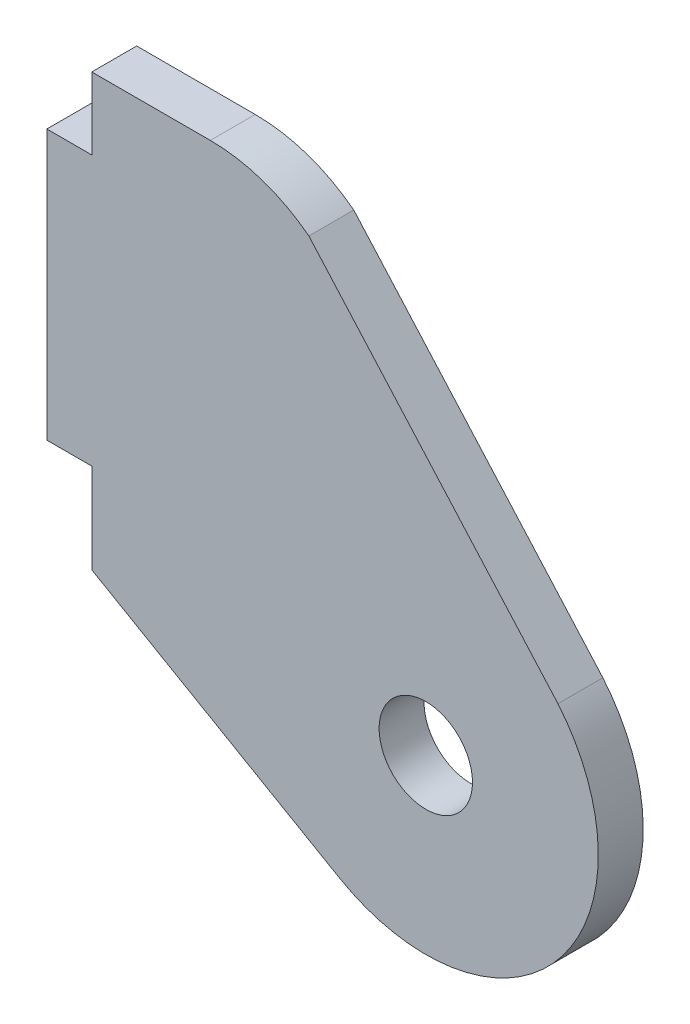
ISO-10303-21;
HEADER;
FILE_DESCRIPTION(('STEP AP214'),'2;1');
FILE_NAME('part.step','',(''),(''),'','','');
FILE_SCHEMA(('AUTOMOTIVE_DESIGN { 1 0 10303 214 1 1 1 1 }'));
ENDSEC;
DATA;
#1=APPLICATION_CONTEXT('core data for automotive mechanical design processes');
#2=APPLICATION_PROTOCOL_DEFINITION('international standard','automotive_design',2000,#1);
#3=PRODUCT_CONTEXT('',#1,'mechanical');
#4=PRODUCT('Part','Part','',(#3));
#5=PRODUCT_RELATED_PRODUCT_CATEGORY('part','',(#4));
#6=PRODUCT_DEFINITION_FORMATION('','',#4);
#7=PRODUCT_DEFINITION_CONTEXT('part definition',#1,'design');
#8=PRODUCT_DEFINITION('design','',#6,#7);
#9=PRODUCT_DEFINITION_SHAPE('','',#8);
#10=(LENGTH_UNIT() NAMED_UNIT(*) SI_UNIT(.MILLI.,.METRE.));
#11=(NAMED_UNIT(*) PLANE_ANGLE_UNIT() SI_UNIT($,.RADIAN.));
#12=(NAMED_UNIT(*) SI_UNIT($,.STERADIAN.) SOLID_ANGLE_UNIT());
#13=UNCERTAINTY_MEASURE_WITH_UNIT(LENGTH_MEASURE(1.E-05),#10,'distance_accuracy_value','');
#14=(GEOMETRIC_REPRESENTATION_CONTEXT(3) GLOBAL_UNCERTAINTY_ASSIGNED_CONTEXT((#13)) GLOBAL_UNIT_ASSIGNED_CONTEXT((#10,
#11,#12)) REPRESENTATION_CONTEXT('',''));
#15=CARTESIAN_POINT('',(0.,0.,0.));
#16=DIRECTION('',(0.,0.,1.));
#17=DIRECTION('',(1.,0.,0.));
#18=AXIS2_PLACEMENT_3D('',#15,#16,#17);
#19=CARTESIAN_POINT('',(-52.6209060337579,-54.7758049115137,3.175));
#20=DIRECTION('',(0.,0.,1.));
#21=DIRECTION('',(1.,0.,0.));
#22=AXIS2_PLACEMENT_3D('',#19,#20,#21);
#23=PLANE('',#22);
#24=DIRECTION('',(1.,0.,0.));
#25=VECTOR('',#24,1.);
#26=CARTESIAN_POINT('',(-79.4095433377579,-48.870574021423,3.175));
#27=LINE('',#26,#25);
#28=CARTESIAN_POINT('',(-79.4095433377579,-48.870574021423,3.175));
#29=VERTEX_POINT('',#28);
#30=CARTESIAN_POINT('',(-76.2345433377579,-48.870574021423,3.175));
#31=VERTEX_POINT('',#30);
#32=EDGE_CURVE('E190',#29,#31,#27,.T.);
#33=ORIENTED_EDGE('',*,*,#32,.T.);
#34=DIRECTION('',(0.,-1.,0.));
#35=VECTOR('',#34,1.);
#36=CARTESIAN_POINT('',(-76.2345433377579,-48.870574021423,3.175));
#37=LINE('',#36,#35);
#38=CARTESIAN_POINT('',(-76.2345433377579,-55.220574021423,3.175));
#39=VERTEX_POINT('',#38);
#40=EDGE_CURVE('E114',#31,#39,#37,.T.);
#41=ORIENTED_EDGE('',*,*,#40,.T.);
#42=DIRECTION('',(0.86602540378444,-0.499999999999998,0.));
#43=VECTOR('',#42,1.);
#44=CARTESIAN_POINT('',(-76.2345433377579,-55.220574021423,3.175));
#45=LINE('',#44,#43);
#46=CARTESIAN_POINT('',(-58.7169060337579,-65.3343866344536,3.175));
#47=VERTEX_POINT('',#46);
#48=EDGE_CURVE('E219',#39,#47,#45,.T.);
#49=ORIENTED_EDGE('',*,*,#48,.T.);
#50=CARTESIAN_POINT('',(-52.6209060337579,-54.7758049115137,3.175));
#51=DIRECTION('',(0.,0.,1.));
#52=DIRECTION('',(1.,0.,0.));
#53=AXIS2_PLACEMENT_3D('',#50,#51,#52);
#54=CIRCLE('',#53,12.192);
#55=CARTESIAN_POINT('',(-43.2812921832516,-46.9389383742151,3.175));
#56=VERTEX_POINT('',#55);
#57=EDGE_CURVE('E239',#47,#56,#54,.T.);
#58=ORIENTED_EDGE('',*,*,#57,.T.);
#59=DIRECTION('',(-0.663926694796662,0.747797662430407,0.));
#60=VECTOR('',#59,1.);
#61=CARTESIAN_POINT('',(-60.8896531494987,-27.1061898599786,3.175));
#62=LINE('',#61,#60);
#63=CARTESIAN_POINT('',(-60.8896531494987,-27.1061898599786,3.175));
#64=VERTEX_POINT('',#63);
#65=EDGE_CURVE('E235',#56,#64,#62,.T.);
#66=ORIENTED_EDGE('',*,*,#65,.T.);
#67=CARTESIAN_POINT('',(-67.8525433377579,-36.170574021423,3.175));
#68=DIRECTION('',(0.,0.,1.));
#69=DIRECTION('',(-1.,0.,0.));
#70=AXIS2_PLACEMENT_3D('',#67,#68,#69);
#71=CIRCLE('',#70,11.43);
#72=CARTESIAN_POINT('',(-67.8525433377579,-24.740574021423,3.175));
#73=VERTEX_POINT('',#72);
#74=EDGE_CURVE('E238',#64,#73,#71,.T.);
#75=ORIENTED_EDGE('',*,*,#74,.T.);
#76=DIRECTION('',(-1.,0.,0.));
#77=VECTOR('',#76,1.);
#78=CARTESIAN_POINT('',(-76.2345433377579,-24.740574021423,3.175));
#79=LINE('',#78,#77);
#80=CARTESIAN_POINT('',(-76.2345433377579,-24.740574021423,3.175));
#81=VERTEX_POINT('',#80);
#82=EDGE_CURVE('E139',#73,#81,#79,.T.);
#83=ORIENTED_EDGE('',*,*,#82,.T.);
#84=DIRECTION('',(0.,-1.,0.));
#85=VECTOR('',#84,1.);
#86=CARTESIAN_POINT('',(-76.2345433377579,-29.820574021423,3.175));
#87=LINE('',#86,#85);
#88=CARTESIAN_POINT('',(-76.2345433377579,-29.820574021423,3.175));
#89=VERTEX_POINT('',#88);
#90=EDGE_CURVE('E133',#81,#89,#87,.T.);
#91=ORIENTED_EDGE('',*,*,#90,.T.);
#92=DIRECTION('',(-1.,0.,0.));
#93=VECTOR('',#92,1.);
#94=CARTESIAN_POINT('',(-79.4095433377579,-29.820574021423,3.175));
#95=LINE('',#94,#93);
#96=CARTESIAN_POINT('',(-79.4095433377579,-29.820574021423,3.175));
#97=VERTEX_POINT('',#96);
#98=EDGE_CURVE('E137',#89,#97,#95,.T.);
#99=ORIENTED_EDGE('',*,*,#98,.T.);
#100=DIRECTION('',(0.,-1.,0.));
#101=VECTOR('',#100,1.);
#102=CARTESIAN_POINT('',(-79.4095433377579,-48.870574021423,3.175));
#103=LINE('',#102,#101);
#104=EDGE_CURVE('E65',#97,#29,#103,.T.);
#105=ORIENTED_EDGE('',*,*,#104,.T.);
#106=EDGE_LOOP('',(#33,#41,#49,#58,#66,#75,#83,#91,#99,#105));
#107=FACE_BOUND('',#106,.T.);
#108=CARTESIAN_POINT('',(-52.6209060337579,-54.7758049115137,3.175));
#109=DIRECTION('',(0.,0.,1.));
#110=DIRECTION('',(1.,0.,0.));
#111=AXIS2_PLACEMENT_3D('',#108,#109,#110);
#112=CIRCLE('',#111,3.3);
#113=CARTESIAN_POINT('',(-49.3209060337579,-54.7758049115137,3.175));
#114=VERTEX_POINT('',#113);
#115=EDGE_CURVE('E166',#114,#114,#112,.T.);
#116=ORIENTED_EDGE('',*,*,#115,.F.);
#117=EDGE_LOOP('',(#116));
#118=FACE_BOUND('',#117,.T.);
#119=ADVANCED_FACE('F47',(#107,#118),#23,.T.);
#120=CARTESIAN_POINT('',(-52.6209060337579,-54.7758049115137,0.));
#121=DIRECTION('',(0.,0.,1.));
#122=DIRECTION('',(1.,0.,0.));
#123=AXIS2_PLACEMENT_3D('',#120,#121,#122);
#124=PLANE('',#123);
#125=DIRECTION('',(1.,0.,0.));
#126=VECTOR('',#125,1.);
#127=CARTESIAN_POINT('',(-79.4095433377579,-48.870574021423,0.));
#128=LINE('',#127,#126);
#129=CARTESIAN_POINT('',(-79.4095433377579,-48.870574021423,0.));
#130=VERTEX_POINT('',#129);
#131=CARTESIAN_POINT('',(-76.2345433377579,-48.870574021423,0.));
#132=VERTEX_POINT('',#131);
#133=EDGE_CURVE('E161',#130,#132,#128,.T.);
#134=ORIENTED_EDGE('',*,*,#133,.F.);
#135=DIRECTION('',(0.,-1.,0.));
#136=VECTOR('',#135,1.);
#137=CARTESIAN_POINT('',(-79.4095433377579,-48.870574021423,0.));
#138=LINE('',#137,#136);
#139=CARTESIAN_POINT('',(-79.4095433377579,-29.820574021423,0.));
#140=VERTEX_POINT('',#139);
#141=EDGE_CURVE('E106',#140,#130,#138,.T.);
#142=ORIENTED_EDGE('',*,*,#141,.F.);
#143=DIRECTION('',(-1.,0.,0.));
#144=VECTOR('',#143,1.);
#145=CARTESIAN_POINT('',(-79.4095433377579,-29.820574021423,0.));
#146=LINE('',#145,#144);
#147=CARTESIAN_POINT('',(-76.2345433377579,-29.820574021423,0.));
#148=VERTEX_POINT('',#147);
#149=EDGE_CURVE('E100',#148,#140,#146,.T.);
#150=ORIENTED_EDGE('',*,*,#149,.F.);
#151=DIRECTION('',(0.,-1.,0.));
#152=VECTOR('',#151,1.);
#153=CARTESIAN_POINT('',(-76.2345433377579,-29.820574021423,0.));
#154=LINE('',#153,#152);
#155=CARTESIAN_POINT('',(-76.2345433377579,-24.740574021423,0.));
#156=VERTEX_POINT('',#155);
#157=EDGE_CURVE('E148',#156,#148,#154,.T.);
#158=ORIENTED_EDGE('',*,*,#157,.F.);
#159=DIRECTION('',(-1.,0.,0.));
#160=VECTOR('',#159,1.);
#161=CARTESIAN_POINT('',(-76.2345433377579,-24.740574021423,0.));
#162=LINE('',#161,#160);
#163=CARTESIAN_POINT('',(-67.8525433377579,-24.740574021423,0.));
#164=VERTEX_POINT('',#163);
#165=EDGE_CURVE('E181',#164,#156,#162,.T.);
#166=ORIENTED_EDGE('',*,*,#165,.F.);
#167=CARTESIAN_POINT('',(-67.8525433377579,-36.170574021423,0.));
#168=DIRECTION('',(0.,0.,1.));
#169=DIRECTION('',(-1.,0.,0.));
#170=AXIS2_PLACEMENT_3D('',#167,#168,#169);
#171=CIRCLE('',#170,11.43);
#172=CARTESIAN_POINT('',(-60.8896531494987,-27.1061898599786,0.));
#173=VERTEX_POINT('',#172);
#174=EDGE_CURVE('E178',#173,#164,#171,.T.);
#175=ORIENTED_EDGE('',*,*,#174,.F.);
#176=DIRECTION('',(-0.663926694796662,0.747797662430407,0.));
#177=VECTOR('',#176,1.);
#178=CARTESIAN_POINT('',(-60.8896531494987,-27.1061898599786,0.));
#179=LINE('',#178,#177);
#180=CARTESIAN_POINT('',(-43.2812921832516,-46.9389383742151,0.));
#181=VERTEX_POINT('',#180);
#182=EDGE_CURVE('E175',#181,#173,#179,.T.);
#183=ORIENTED_EDGE('',*,*,#182,.F.);
#184=CARTESIAN_POINT('',(-52.6209060337579,-54.7758049115137,0.));
#185=DIRECTION('',(0.,0.,1.));
#186=DIRECTION('',(1.,0.,0.));
#187=AXIS2_PLACEMENT_3D('',#184,#185,#186);
#188=CIRCLE('',#187,12.192);
#189=CARTESIAN_POINT('',(-58.7169060337579,-65.3343866344536,0.));
#190=VERTEX_POINT('',#189);
#191=EDGE_CURVE('E172',#190,#181,#188,.T.);
#192=ORIENTED_EDGE('',*,*,#191,.F.);
#193=DIRECTION('',(0.86602540378444,-0.499999999999998,0.));
#194=VECTOR('',#193,1.);
#195=CARTESIAN_POINT('',(-76.2345433377579,-55.220574021423,0.));
#196=LINE('',#195,#194);
#197=CARTESIAN_POINT('',(-76.2345433377579,-55.220574021423,0.));
#198=VERTEX_POINT('',#197);
#199=EDGE_CURVE('E169',#198,#190,#196,.T.);
#200=ORIENTED_EDGE('',*,*,#199,.F.);
#201=DIRECTION('',(0.,-1.,0.));
#202=VECTOR('',#201,1.);
#203=CARTESIAN_POINT('',(-76.2345433377579,-48.870574021423,0.));
#204=LINE('',#203,#202);
#205=EDGE_CURVE('E165',#132,#198,#204,.T.);
#206=ORIENTED_EDGE('',*,*,#205,.F.);
#207=EDGE_LOOP('',(#134,#142,#150,#158,#166,#175,#183,#192,#200,#206));
#208=FACE_BOUND('',#207,.T.);
#209=CARTESIAN_POINT('',(-52.6209060337579,-54.7758049115137,0.));
#210=DIRECTION('',(0.,0.,1.));
#211=DIRECTION('',(1.,0.,0.));
#212=AXIS2_PLACEMENT_3D('',#209,#210,#211);
#213=CIRCLE('',#212,3.3);
#214=CARTESIAN_POINT('',(-49.3209060337579,-54.7758049115137,0.));
#215=VERTEX_POINT('',#214);
#216=EDGE_CURVE('E253',#215,#215,#213,.T.);
#217=ORIENTED_EDGE('',*,*,#216,.T.);
#218=EDGE_LOOP('',(#217));
#219=FACE_BOUND('',#218,.T.);
#220=ADVANCED_FACE('F223',(#208,#219),#124,.F.);
#221=CARTESIAN_POINT('',(-79.4095433377579,-48.870574021423,3.175));
#222=DIRECTION('',(0.,1.,0.));
#223=DIRECTION('',(0.,0.,1.));
#224=AXIS2_PLACEMENT_3D('',#221,#222,#223);
#225=PLANE('',#224);
#226=ORIENTED_EDGE('',*,*,#133,.T.);
#227=DIRECTION('',(0.,0.,-1.));
#228=VECTOR('',#227,1.);
#229=CARTESIAN_POINT('',(-76.2345433377579,-48.870574021423,3.175));
#230=LINE('',#229,#228);
#231=EDGE_CURVE('E11',#31,#132,#230,.T.);
#232=ORIENTED_EDGE('',*,*,#231,.F.);
#233=ORIENTED_EDGE('',*,*,#32,.F.);
#234=DIRECTION('',(0.,0.,-1.));
#235=VECTOR('',#234,1.);
#236=CARTESIAN_POINT('',(-79.4095433377579,-48.870574021423,3.175));
#237=LINE('',#236,#235);
#238=EDGE_CURVE('E157',#29,#130,#237,.T.);
#239=ORIENTED_EDGE('',*,*,#238,.T.);
#240=EDGE_LOOP('',(#226,#232,#233,#239));
#241=FACE_BOUND('',#240,.T.);
#242=ADVANCED_FACE('F49',(#241),#225,.F.);
#243=CARTESIAN_POINT('',(-76.2345433377579,-48.870574021423,3.175));
#244=DIRECTION('',(1.,0.,0.));
#245=DIRECTION('',(0.,1.,0.));
#246=AXIS2_PLACEMENT_3D('',#243,#244,#245);
#247=PLANE('',#246);
#248=ORIENTED_EDGE('',*,*,#205,.T.);
#249=DIRECTION('',(0.,0.,-1.));
#250=VECTOR('',#249,1.);
#251=CARTESIAN_POINT('',(-76.2345433377579,-55.220574021423,3.175));
#252=LINE('',#251,#250);
#253=EDGE_CURVE('E57',#39,#198,#252,.T.);
#254=ORIENTED_EDGE('',*,*,#253,.F.);
#255=ORIENTED_EDGE('',*,*,#40,.F.);
#256=ORIENTED_EDGE('',*,*,#231,.T.);
#257=EDGE_LOOP('',(#248,#254,#255,#256));
#258=FACE_BOUND('',#257,.T.);
#259=ADVANCED_FACE('F291',(#258),#247,.F.);
#260=CARTESIAN_POINT('',(-76.2345433377579,-55.220574021423,3.175));
#261=DIRECTION('',(0.499999999999998,0.86602540378444,0.));
#262=DIRECTION('',(-0.86602540378444,0.499999999999998,0.));
#263=AXIS2_PLACEMENT_3D('',#260,#261,#262);
#264=PLANE('',#263);
#265=ORIENTED_EDGE('',*,*,#199,.T.);
#266=DIRECTION('',(0.,0.,-1.));
#267=VECTOR('',#266,1.);
#268=CARTESIAN_POINT('',(-58.7169060337579,-65.3343866344536,3.175));
#269=LINE('',#268,#267);
#270=EDGE_CURVE('E209',#47,#190,#269,.T.);
#271=ORIENTED_EDGE('',*,*,#270,.F.);
#272=ORIENTED_EDGE('',*,*,#48,.F.);
#273=ORIENTED_EDGE('',*,*,#253,.T.);
#274=EDGE_LOOP('',(#265,#271,#272,#273));
#275=FACE_BOUND('',#274,.T.);
#276=ADVANCED_FACE('F217',(#275),#264,.F.);
#277=CARTESIAN_POINT('',(-52.6209060337579,-54.7758049115137,3.175));
#278=DIRECTION('',(0.,0.,-1.));
#279=DIRECTION('',(-1.,0.,0.));
#280=AXIS2_PLACEMENT_3D('',#277,#278,#279);
#281=CYLINDRICAL_SURFACE('',#280,12.192);
#282=ORIENTED_EDGE('',*,*,#191,.T.);
#283=DIRECTION('',(0.,0.,-1.));
#284=VECTOR('',#283,1.);
#285=CARTESIAN_POINT('',(-43.2812921832516,-46.9389383742151,3.175));
#286=LINE('',#285,#284);
#287=EDGE_CURVE('E205',#56,#181,#286,.T.);
#288=ORIENTED_EDGE('',*,*,#287,.F.);
#289=ORIENTED_EDGE('',*,*,#57,.F.);
#290=ORIENTED_EDGE('',*,*,#270,.T.);
#291=EDGE_LOOP('',(#282,#288,#289,#290));
#292=FACE_BOUND('',#291,.T.);
#293=ADVANCED_FACE('F229',(#292),#281,.T.);
#294=CARTESIAN_POINT('',(-60.8896531494987,-27.1061898599786,3.175));
#295=DIRECTION('',(-0.747797662430407,-0.663926694796661,0.));
#296=DIRECTION('',(0.663926694796661,-0.747797662430407,0.));
#297=AXIS2_PLACEMENT_3D('',#294,#295,#296);
#298=PLANE('',#297);
#299=ORIENTED_EDGE('',*,*,#182,.T.);
#300=DIRECTION('',(0.,0.,-1.));
#301=VECTOR('',#300,1.);
#302=CARTESIAN_POINT('',(-60.8896531494987,-27.1061898599786,3.175));
#303=LINE('',#302,#301);
#304=EDGE_CURVE('E201',#64,#173,#303,.T.);
#305=ORIENTED_EDGE('',*,*,#304,.F.);
#306=ORIENTED_EDGE('',*,*,#65,.F.);
#307=ORIENTED_EDGE('',*,*,#287,.T.);
#308=EDGE_LOOP('',(#299,#305,#306,#307));
#309=FACE_BOUND('',#308,.T.);
#310=ADVANCED_FACE('F233',(#309),#298,.F.);
#311=CARTESIAN_POINT('',(-67.8525433377579,-36.170574021423,3.175));
#312=DIRECTION('',(0.,0.,-1.));
#313=DIRECTION('',(-1.,0.,0.));
#314=AXIS2_PLACEMENT_3D('',#311,#312,#313);
#315=CYLINDRICAL_SURFACE('',#314,11.43);
#316=ORIENTED_EDGE('',*,*,#174,.T.);
#317=DIRECTION('',(0.,0.,-1.));
#318=VECTOR('',#317,1.);
#319=CARTESIAN_POINT('',(-67.8525433377579,-24.740574021423,3.175));
#320=LINE('',#319,#318);
#321=EDGE_CURVE('E197',#73,#164,#320,.T.);
#322=ORIENTED_EDGE('',*,*,#321,.F.);
#323=ORIENTED_EDGE('',*,*,#74,.F.);
#324=ORIENTED_EDGE('',*,*,#304,.T.);
#325=EDGE_LOOP('',(#316,#322,#323,#324));
#326=FACE_BOUND('',#325,.T.);
#327=ADVANCED_FACE('F281',(#326),#315,.T.);
#328=CARTESIAN_POINT('',(-76.2345433377579,-24.740574021423,3.175));
#329=DIRECTION('',(0.,-1.,0.));
#330=DIRECTION('',(0.,0.,-1.));
#331=AXIS2_PLACEMENT_3D('',#328,#329,#330);
#332=PLANE('',#331);
#333=ORIENTED_EDGE('',*,*,#165,.T.);
#334=DIRECTION('',(0.,0.,-1.));
#335=VECTOR('',#334,1.);
#336=CARTESIAN_POINT('',(-76.2345433377579,-24.740574021423,3.175));
#337=LINE('',#336,#335);
#338=EDGE_CURVE('E150',#81,#156,#337,.T.);
#339=ORIENTED_EDGE('',*,*,#338,.F.);
#340=ORIENTED_EDGE('',*,*,#82,.F.);
#341=ORIENTED_EDGE('',*,*,#321,.T.);
#342=EDGE_LOOP('',(#333,#339,#340,#341));
#343=FACE_BOUND('',#342,.T.);
#344=ADVANCED_FACE('F278',(#343),#332,.F.);
#345=CARTESIAN_POINT('',(-76.2345433377579,-29.820574021423,3.175));
#346=DIRECTION('',(1.,0.,0.));
#347=DIRECTION('',(0.,0.,-1.));
#348=AXIS2_PLACEMENT_3D('',#345,#346,#347);
#349=PLANE('',#348);
#350=ORIENTED_EDGE('',*,*,#157,.T.);
#351=DIRECTION('',(0.,0.,-1.));
#352=VECTOR('',#351,1.);
#353=CARTESIAN_POINT('',(-76.2345433377579,-29.820574021423,3.175));
#354=LINE('',#353,#352);
#355=EDGE_CURVE('E145',#89,#148,#354,.T.);
#356=ORIENTED_EDGE('',*,*,#355,.F.);
#357=ORIENTED_EDGE('',*,*,#90,.F.);
#358=ORIENTED_EDGE('',*,*,#338,.T.);
#359=EDGE_LOOP('',(#350,#356,#357,#358));
#360=FACE_BOUND('',#359,.T.);
#361=ADVANCED_FACE('F146',(#360),#349,.F.);
#362=CARTESIAN_POINT('',(-79.4095433377579,-29.820574021423,3.175));
#363=DIRECTION('',(0.,-1.,0.));
#364=DIRECTION('',(0.,0.,-1.));
#365=AXIS2_PLACEMENT_3D('',#362,#363,#364);
#366=PLANE('',#365);
#367=ORIENTED_EDGE('',*,*,#149,.T.);
#368=DIRECTION('',(0.,0.,-1.));
#369=VECTOR('',#368,1.);
#370=CARTESIAN_POINT('',(-79.4095433377579,-29.820574021423,3.175));
#371=LINE('',#370,#369);
#372=EDGE_CURVE('E151',#97,#140,#371,.T.);
#373=ORIENTED_EDGE('',*,*,#372,.F.);
#374=ORIENTED_EDGE('',*,*,#98,.F.);
#375=ORIENTED_EDGE('',*,*,#355,.T.);
#376=EDGE_LOOP('',(#367,#373,#374,#375));
#377=FACE_BOUND('',#376,.T.);
#378=ADVANCED_FACE('F153',(#377),#366,.F.);
#379=CARTESIAN_POINT('',(-79.4095433377579,-48.870574021423,3.175));
#380=DIRECTION('',(1.,0.,0.));
#381=DIRECTION('',(0.,0.,-1.));
#382=AXIS2_PLACEMENT_3D('',#379,#380,#381);
#383=PLANE('',#382);
#384=ORIENTED_EDGE('',*,*,#141,.T.);
#385=ORIENTED_EDGE('',*,*,#238,.F.);
#386=ORIENTED_EDGE('',*,*,#104,.F.);
#387=ORIENTED_EDGE('',*,*,#372,.T.);
#388=EDGE_LOOP('',(#384,#385,#386,#387));
#389=FACE_BOUND('',#388,.T.);
#390=ADVANCED_FACE('F271',(#389),#383,.F.);
#391=CARTESIAN_POINT('',(-52.6209060337579,-54.7758049115137,3.175));
#392=DIRECTION('',(0.,0.,-1.));
#393=DIRECTION('',(-1.,0.,0.));
#394=AXIS2_PLACEMENT_3D('',#391,#392,#393);
#395=CYLINDRICAL_SURFACE('',#394,3.3);
#396=ORIENTED_EDGE('',*,*,#115,.T.);
#397=EDGE_LOOP('',(#396));
#398=FACE_BOUND('',#397,.T.);
#399=ORIENTED_EDGE('',*,*,#216,.F.);
#400=EDGE_LOOP('',(#399));
#401=FACE_BOUND('',#400,.T.);
#402=ADVANCED_FACE('F261',(#398,#401),#395,.F.);
#403=CLOSED_SHELL('',(#119,#220,#242,#259,#276,#293,#310,#327,#344,#361,#378,#390,#402));
#404=MANIFOLD_SOLID_BREP('B2',#403);
#405=ADVANCED_BREP_SHAPE_REPRESENTATION('',(#18,#404),#14);
#406=SHAPE_DEFINITION_REPRESENTATION(#9,#405);
ENDSEC;
END-ISO-10303-21;
